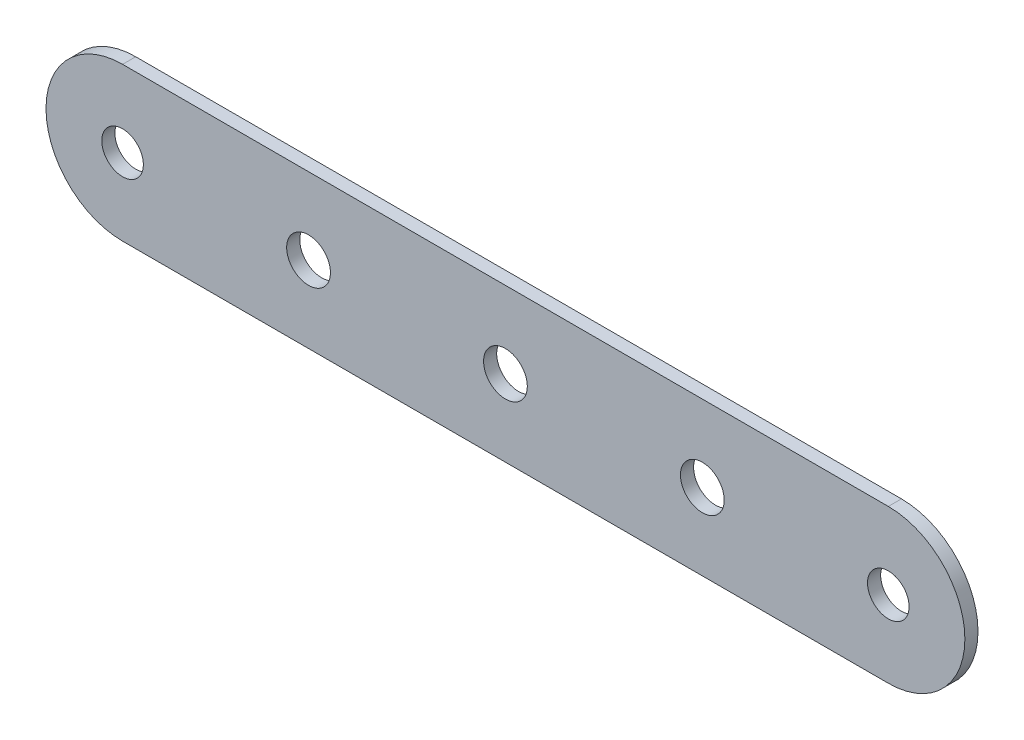
ISO-10303-21;
HEADER;
FILE_DESCRIPTION(('STEP AP214'),'2;1');
FILE_NAME('part.step','',(''),(''),'','','');
FILE_SCHEMA(('AUTOMOTIVE_DESIGN { 1 0 10303 214 1 1 1 1 }'));
ENDSEC;
DATA;
#1=APPLICATION_CONTEXT('core data for automotive mechanical design processes');
#2=APPLICATION_PROTOCOL_DEFINITION('international standard','automotive_design',2000,#1);
#3=PRODUCT_CONTEXT('',#1,'mechanical');
#4=PRODUCT('Part','Part','',(#3));
#5=PRODUCT_RELATED_PRODUCT_CATEGORY('part','',(#4));
#6=PRODUCT_DEFINITION_FORMATION('','',#4);
#7=PRODUCT_DEFINITION_CONTEXT('part definition',#1,'design');
#8=PRODUCT_DEFINITION('design','',#6,#7);
#9=PRODUCT_DEFINITION_SHAPE('','',#8);
#10=(LENGTH_UNIT() NAMED_UNIT(*) SI_UNIT(.MILLI.,.METRE.));
#11=(NAMED_UNIT(*) PLANE_ANGLE_UNIT() SI_UNIT($,.RADIAN.));
#12=(NAMED_UNIT(*) SI_UNIT($,.STERADIAN.) SOLID_ANGLE_UNIT());
#13=UNCERTAINTY_MEASURE_WITH_UNIT(LENGTH_MEASURE(1.E-05),#10,'distance_accuracy_value','');
#14=(GEOMETRIC_REPRESENTATION_CONTEXT(3) GLOBAL_UNCERTAINTY_ASSIGNED_CONTEXT((#13)) GLOBAL_UNIT_ASSIGNED_CONTEXT((#10,
#11,#12)) REPRESENTATION_CONTEXT('',''));
#15=CARTESIAN_POINT('',(0.,0.,0.));
#16=DIRECTION('',(0.,0.,1.));
#17=DIRECTION('',(1.,0.,0.));
#18=AXIS2_PLACEMENT_3D('',#15,#16,#17);
#19=CARTESIAN_POINT('',(-35.5296878485161,2.13114754098369,6.));
#20=DIRECTION('',(0.,0.,1.));
#21=DIRECTION('',(1.,0.,0.));
#22=AXIS2_PLACEMENT_3D('',#19,#20,#21);
#23=PLANE('',#22);
#24=CARTESIAN_POINT('',(229.470312151484,2.13114754098369,6.));
#25=DIRECTION('',(0.,0.,1.));
#26=DIRECTION('',(1.,0.,0.));
#27=AXIS2_PLACEMENT_3D('',#24,#25,#26);
#28=CIRCLE('',#27,10.);
#29=CARTESIAN_POINT('',(239.470312151484,2.13114754098369,6.));
#30=VERTEX_POINT('',#29);
#31=EDGE_CURVE('E134',#30,#30,#28,.T.);
#32=ORIENTED_EDGE('',*,*,#31,.F.);
#33=EDGE_LOOP('',(#32));
#34=FACE_BOUND('',#33,.T.);
#35=CARTESIAN_POINT('',(314.470312151484,2.13114754098369,6.));
#36=DIRECTION('',(0.,0.,1.));
#37=DIRECTION('',(1.,0.,0.));
#38=AXIS2_PLACEMENT_3D('',#35,#36,#37);
#39=CIRCLE('',#38,9.50000000000001);
#40=CARTESIAN_POINT('',(323.970312151484,2.13114754098369,6.));
#41=VERTEX_POINT('',#40);
#42=EDGE_CURVE('E123',#41,#41,#39,.T.);
#43=ORIENTED_EDGE('',*,*,#42,.F.);
#44=EDGE_LOOP('',(#43));
#45=FACE_BOUND('',#44,.T.);
#46=CARTESIAN_POINT('',(-35.5296878485161,2.13114754098369,6.));
#47=DIRECTION('',(0.,0.,1.));
#48=DIRECTION('',(1.,0.,0.));
#49=AXIS2_PLACEMENT_3D('',#46,#47,#48);
#50=CIRCLE('',#49,35.);
#51=CARTESIAN_POINT('',(-35.5296878485161,37.1311475409837,6.));
#52=VERTEX_POINT('',#51);
#53=CARTESIAN_POINT('',(-35.5296878485161,-32.8688524590163,6.));
#54=VERTEX_POINT('',#53);
#55=EDGE_CURVE('E91',#52,#54,#50,.T.);
#56=ORIENTED_EDGE('',*,*,#55,.T.);
#57=DIRECTION('',(1.,0.,0.));
#58=VECTOR('',#57,1.);
#59=CARTESIAN_POINT('',(-35.5296878485161,-32.8688524590163,6.));
#60=LINE('',#59,#58);
#61=CARTESIAN_POINT('',(314.470312151484,-32.8688524590163,6.));
#62=VERTEX_POINT('',#61);
#63=EDGE_CURVE('E86',#54,#62,#60,.T.);
#64=ORIENTED_EDGE('',*,*,#63,.T.);
#65=CARTESIAN_POINT('',(314.470312151484,2.13114754098369,6.));
#66=DIRECTION('',(0.,0.,1.));
#67=DIRECTION('',(1.,0.,0.));
#68=AXIS2_PLACEMENT_3D('',#65,#66,#67);
#69=CIRCLE('',#68,35.);
#70=CARTESIAN_POINT('',(314.470312151484,37.1311475409837,6.));
#71=VERTEX_POINT('',#70);
#72=EDGE_CURVE('E89',#62,#71,#69,.T.);
#73=ORIENTED_EDGE('',*,*,#72,.T.);
#74=DIRECTION('',(-1.,0.,0.));
#75=VECTOR('',#74,1.);
#76=CARTESIAN_POINT('',(-35.5296878485161,37.1311475409837,6.));
#77=LINE('',#76,#75);
#78=EDGE_CURVE('E56',#71,#52,#77,.T.);
#79=ORIENTED_EDGE('',*,*,#78,.T.);
#80=EDGE_LOOP('',(#56,#64,#73,#79));
#81=FACE_BOUND('',#80,.T.);
#82=CARTESIAN_POINT('',(-35.5296878485161,2.13114754098369,6.));
#83=DIRECTION('',(0.,0.,1.));
#84=DIRECTION('',(1.,0.,0.));
#85=AXIS2_PLACEMENT_3D('',#82,#83,#84);
#86=CIRCLE('',#85,9.5);
#87=CARTESIAN_POINT('',(-26.0296878485161,2.13114754098369,6.));
#88=VERTEX_POINT('',#87);
#89=EDGE_CURVE('E113',#88,#88,#86,.T.);
#90=ORIENTED_EDGE('',*,*,#89,.F.);
#91=EDGE_LOOP('',(#90));
#92=FACE_BOUND('',#91,.T.);
#93=CARTESIAN_POINT('',(139.470312151484,2.13114754098369,6.));
#94=DIRECTION('',(0.,0.,1.));
#95=DIRECTION('',(1.,0.,0.));
#96=AXIS2_PLACEMENT_3D('',#93,#94,#95);
#97=CIRCLE('',#96,10.);
#98=CARTESIAN_POINT('',(149.470312151484,2.13114754098369,6.));
#99=VERTEX_POINT('',#98);
#100=EDGE_CURVE('E133',#99,#99,#97,.T.);
#101=ORIENTED_EDGE('',*,*,#100,.F.);
#102=EDGE_LOOP('',(#101));
#103=FACE_BOUND('',#102,.T.);
#104=CARTESIAN_POINT('',(49.4703121514839,2.13114754098305,6.));
#105=DIRECTION('',(0.,0.,1.));
#106=DIRECTION('',(1.,0.,0.));
#107=AXIS2_PLACEMENT_3D('',#104,#105,#106);
#108=CIRCLE('',#107,10.);
#109=CARTESIAN_POINT('',(59.4703121514839,2.13114754098305,6.));
#110=VERTEX_POINT('',#109);
#111=EDGE_CURVE('E140',#110,#110,#108,.T.);
#112=ORIENTED_EDGE('',*,*,#111,.F.);
#113=EDGE_LOOP('',(#112));
#114=FACE_BOUND('',#113,.T.);
#115=ADVANCED_FACE('F39',(#34,#45,#81,#92,#103,#114),#23,.T.);
#116=CARTESIAN_POINT('',(-35.5296878485161,2.13114754098369,0.));
#117=DIRECTION('',(0.,0.,1.));
#118=DIRECTION('',(1.,0.,0.));
#119=AXIS2_PLACEMENT_3D('',#116,#117,#118);
#120=PLANE('',#119);
#121=CARTESIAN_POINT('',(-35.5296878485161,2.13114754098369,0.));
#122=DIRECTION('',(0.,0.,1.));
#123=DIRECTION('',(1.,0.,0.));
#124=AXIS2_PLACEMENT_3D('',#121,#122,#123);
#125=CIRCLE('',#124,35.);
#126=CARTESIAN_POINT('',(-35.5296878485161,37.1311475409837,0.));
#127=VERTEX_POINT('',#126);
#128=CARTESIAN_POINT('',(-35.5296878485161,-32.8688524590163,0.));
#129=VERTEX_POINT('',#128);
#130=EDGE_CURVE('E118',#127,#129,#125,.T.);
#131=ORIENTED_EDGE('',*,*,#130,.F.);
#132=DIRECTION('',(-1.,0.,0.));
#133=VECTOR('',#132,1.);
#134=CARTESIAN_POINT('',(-35.5296878485161,37.1311475409837,0.));
#135=LINE('',#134,#133);
#136=CARTESIAN_POINT('',(314.470312151484,37.1311475409837,0.));
#137=VERTEX_POINT('',#136);
#138=EDGE_CURVE('E79',#137,#127,#135,.T.);
#139=ORIENTED_EDGE('',*,*,#138,.F.);
#140=CARTESIAN_POINT('',(314.470312151484,2.13114754098369,0.));
#141=DIRECTION('',(0.,0.,1.));
#142=DIRECTION('',(1.,0.,0.));
#143=AXIS2_PLACEMENT_3D('',#140,#141,#142);
#144=CIRCLE('',#143,35.);
#145=CARTESIAN_POINT('',(314.470312151484,-32.8688524590163,0.));
#146=VERTEX_POINT('',#145);
#147=EDGE_CURVE('E73',#146,#137,#144,.T.);
#148=ORIENTED_EDGE('',*,*,#147,.F.);
#149=DIRECTION('',(1.,0.,0.));
#150=VECTOR('',#149,1.);
#151=CARTESIAN_POINT('',(-35.5296878485161,-32.8688524590163,0.));
#152=LINE('',#151,#150);
#153=EDGE_CURVE('E95',#129,#146,#152,.T.);
#154=ORIENTED_EDGE('',*,*,#153,.F.);
#155=EDGE_LOOP('',(#131,#139,#148,#154));
#156=FACE_BOUND('',#155,.T.);
#157=CARTESIAN_POINT('',(-35.5296878485161,2.13114754098369,0.));
#158=DIRECTION('',(0.,0.,1.));
#159=DIRECTION('',(1.,0.,0.));
#160=AXIS2_PLACEMENT_3D('',#157,#158,#159);
#161=CIRCLE('',#160,9.5);
#162=CARTESIAN_POINT('',(-26.0296878485161,2.13114754098369,0.));
#163=VERTEX_POINT('',#162);
#164=EDGE_CURVE('E119',#163,#163,#161,.T.);
#165=ORIENTED_EDGE('',*,*,#164,.T.);
#166=EDGE_LOOP('',(#165));
#167=FACE_BOUND('',#166,.T.);
#168=CARTESIAN_POINT('',(314.470312151484,2.13114754098369,0.));
#169=DIRECTION('',(0.,0.,1.));
#170=DIRECTION('',(1.,0.,0.));
#171=AXIS2_PLACEMENT_3D('',#168,#169,#170);
#172=CIRCLE('',#171,9.50000000000001);
#173=CARTESIAN_POINT('',(323.970312151484,2.13114754098369,0.));
#174=VERTEX_POINT('',#173);
#175=EDGE_CURVE('E120',#174,#174,#172,.T.);
#176=ORIENTED_EDGE('',*,*,#175,.T.);
#177=EDGE_LOOP('',(#176));
#178=FACE_BOUND('',#177,.T.);
#179=CARTESIAN_POINT('',(139.470312151484,2.13114754098369,0.));
#180=DIRECTION('',(0.,0.,1.));
#181=DIRECTION('',(1.,0.,0.));
#182=AXIS2_PLACEMENT_3D('',#179,#180,#181);
#183=CIRCLE('',#182,10.);
#184=CARTESIAN_POINT('',(149.470312151484,2.13114754098369,0.));
#185=VERTEX_POINT('',#184);
#186=EDGE_CURVE('E131',#185,#185,#183,.T.);
#187=ORIENTED_EDGE('',*,*,#186,.T.);
#188=EDGE_LOOP('',(#187));
#189=FACE_BOUND('',#188,.T.);
#190=CARTESIAN_POINT('',(229.470312151484,2.13114754098369,0.));
#191=DIRECTION('',(0.,0.,1.));
#192=DIRECTION('',(1.,0.,0.));
#193=AXIS2_PLACEMENT_3D('',#190,#191,#192);
#194=CIRCLE('',#193,10.);
#195=CARTESIAN_POINT('',(239.470312151484,2.13114754098369,0.));
#196=VERTEX_POINT('',#195);
#197=EDGE_CURVE('E138',#196,#196,#194,.T.);
#198=ORIENTED_EDGE('',*,*,#197,.T.);
#199=EDGE_LOOP('',(#198));
#200=FACE_BOUND('',#199,.T.);
#201=CARTESIAN_POINT('',(49.4703121514839,2.13114754098305,0.));
#202=DIRECTION('',(0.,0.,1.));
#203=DIRECTION('',(1.,0.,0.));
#204=AXIS2_PLACEMENT_3D('',#201,#202,#203);
#205=CIRCLE('',#204,10.);
#206=CARTESIAN_POINT('',(59.4703121514839,2.13114754098305,0.));
#207=VERTEX_POINT('',#206);
#208=EDGE_CURVE('E144',#207,#207,#205,.T.);
#209=ORIENTED_EDGE('',*,*,#208,.T.);
#210=EDGE_LOOP('',(#209));
#211=FACE_BOUND('',#210,.T.);
#212=ADVANCED_FACE('F154',(#156,#167,#178,#189,#200,#211),#120,.F.);
#213=CARTESIAN_POINT('',(-35.5296878485161,2.13114754098369,6.));
#214=DIRECTION('',(0.,0.,-1.));
#215=DIRECTION('',(-1.,0.,0.));
#216=AXIS2_PLACEMENT_3D('',#213,#214,#215);
#217=CYLINDRICAL_SURFACE('',#216,35.);
#218=ORIENTED_EDGE('',*,*,#130,.T.);
#219=DIRECTION('',(0.,0.,-1.));
#220=VECTOR('',#219,1.);
#221=CARTESIAN_POINT('',(-35.5296878485161,-32.8688524590163,6.));
#222=LINE('',#221,#220);
#223=EDGE_CURVE('E12',#54,#129,#222,.T.);
#224=ORIENTED_EDGE('',*,*,#223,.F.);
#225=ORIENTED_EDGE('',*,*,#55,.F.);
#226=DIRECTION('',(0.,0.,-1.));
#227=VECTOR('',#226,1.);
#228=CARTESIAN_POINT('',(-35.5296878485161,37.1311475409837,6.));
#229=LINE('',#228,#227);
#230=EDGE_CURVE('E99',#52,#127,#229,.T.);
#231=ORIENTED_EDGE('',*,*,#230,.T.);
#232=EDGE_LOOP('',(#218,#224,#225,#231));
#233=FACE_BOUND('',#232,.T.);
#234=ADVANCED_FACE('F41',(#233),#217,.T.);
#235=CARTESIAN_POINT('',(-35.5296878485161,-32.8688524590163,6.));
#236=DIRECTION('',(0.,1.,0.));
#237=DIRECTION('',(0.,0.,1.));
#238=AXIS2_PLACEMENT_3D('',#235,#236,#237);
#239=PLANE('',#238);
#240=ORIENTED_EDGE('',*,*,#153,.T.);
#241=DIRECTION('',(0.,0.,-1.));
#242=VECTOR('',#241,1.);
#243=CARTESIAN_POINT('',(314.470312151484,-32.8688524590163,6.));
#244=LINE('',#243,#242);
#245=EDGE_CURVE('E48',#62,#146,#244,.T.);
#246=ORIENTED_EDGE('',*,*,#245,.F.);
#247=ORIENTED_EDGE('',*,*,#63,.F.);
#248=ORIENTED_EDGE('',*,*,#223,.T.);
#249=EDGE_LOOP('',(#240,#246,#247,#248));
#250=FACE_BOUND('',#249,.T.);
#251=ADVANCED_FACE('F94',(#250),#239,.F.);
#252=CARTESIAN_POINT('',(314.470312151484,2.13114754098369,6.));
#253=DIRECTION('',(0.,0.,-1.));
#254=DIRECTION('',(-1.,0.,0.));
#255=AXIS2_PLACEMENT_3D('',#252,#253,#254);
#256=CYLINDRICAL_SURFACE('',#255,35.);
#257=ORIENTED_EDGE('',*,*,#147,.T.);
#258=DIRECTION('',(0.,0.,-1.));
#259=VECTOR('',#258,1.);
#260=CARTESIAN_POINT('',(314.470312151484,37.1311475409837,6.));
#261=LINE('',#260,#259);
#262=EDGE_CURVE('E96',#71,#137,#261,.T.);
#263=ORIENTED_EDGE('',*,*,#262,.F.);
#264=ORIENTED_EDGE('',*,*,#72,.F.);
#265=ORIENTED_EDGE('',*,*,#245,.T.);
#266=EDGE_LOOP('',(#257,#263,#264,#265));
#267=FACE_BOUND('',#266,.T.);
#268=ADVANCED_FACE('F97',(#267),#256,.T.);
#269=CARTESIAN_POINT('',(-35.5296878485161,37.1311475409837,6.));
#270=DIRECTION('',(0.,-1.,0.));
#271=DIRECTION('',(0.,0.,-1.));
#272=AXIS2_PLACEMENT_3D('',#269,#270,#271);
#273=PLANE('',#272);
#274=ORIENTED_EDGE('',*,*,#138,.T.);
#275=ORIENTED_EDGE('',*,*,#230,.F.);
#276=ORIENTED_EDGE('',*,*,#78,.F.);
#277=ORIENTED_EDGE('',*,*,#262,.T.);
#278=EDGE_LOOP('',(#274,#275,#276,#277));
#279=FACE_BOUND('',#278,.T.);
#280=ADVANCED_FACE('F168',(#279),#273,.F.);
#281=CARTESIAN_POINT('',(-35.5296878485161,2.13114754098369,6.));
#282=DIRECTION('',(0.,0.,-1.));
#283=DIRECTION('',(-1.,0.,0.));
#284=AXIS2_PLACEMENT_3D('',#281,#282,#283);
#285=CYLINDRICAL_SURFACE('',#284,9.5);
#286=ORIENTED_EDGE('',*,*,#89,.T.);
#287=EDGE_LOOP('',(#286));
#288=FACE_BOUND('',#287,.T.);
#289=ORIENTED_EDGE('',*,*,#164,.F.);
#290=EDGE_LOOP('',(#289));
#291=FACE_BOUND('',#290,.T.);
#292=ADVANCED_FACE('F165',(#288,#291),#285,.F.);
#293=CARTESIAN_POINT('',(314.470312151484,2.13114754098369,6.));
#294=DIRECTION('',(0.,0.,-1.));
#295=DIRECTION('',(-1.,0.,0.));
#296=AXIS2_PLACEMENT_3D('',#293,#294,#295);
#297=CYLINDRICAL_SURFACE('',#296,9.50000000000001);
#298=ORIENTED_EDGE('',*,*,#42,.T.);
#299=EDGE_LOOP('',(#298));
#300=FACE_BOUND('',#299,.T.);
#301=ORIENTED_EDGE('',*,*,#175,.F.);
#302=EDGE_LOOP('',(#301));
#303=FACE_BOUND('',#302,.T.);
#304=ADVANCED_FACE('F208',(#300,#303),#297,.F.);
#305=CARTESIAN_POINT('',(139.470312151484,2.13114754098369,6.));
#306=DIRECTION('',(0.,0.,-1.));
#307=DIRECTION('',(-1.,0.,0.));
#308=AXIS2_PLACEMENT_3D('',#305,#306,#307);
#309=CYLINDRICAL_SURFACE('',#308,10.);
#310=ORIENTED_EDGE('',*,*,#100,.T.);
#311=EDGE_LOOP('',(#310));
#312=FACE_BOUND('',#311,.T.);
#313=ORIENTED_EDGE('',*,*,#186,.F.);
#314=EDGE_LOOP('',(#313));
#315=FACE_BOUND('',#314,.T.);
#316=ADVANCED_FACE('F203',(#312,#315),#309,.F.);
#317=CARTESIAN_POINT('',(229.470312151484,2.13114754098369,6.));
#318=DIRECTION('',(0.,0.,-1.));
#319=DIRECTION('',(-1.,0.,0.));
#320=AXIS2_PLACEMENT_3D('',#317,#318,#319);
#321=CYLINDRICAL_SURFACE('',#320,10.);
#322=ORIENTED_EDGE('',*,*,#31,.T.);
#323=EDGE_LOOP('',(#322));
#324=FACE_BOUND('',#323,.T.);
#325=ORIENTED_EDGE('',*,*,#197,.F.);
#326=EDGE_LOOP('',(#325));
#327=FACE_BOUND('',#326,.T.);
#328=ADVANCED_FACE('F198',(#324,#327),#321,.F.);
#329=CARTESIAN_POINT('',(49.4703121514839,2.13114754098305,6.));
#330=DIRECTION('',(0.,0.,-1.));
#331=DIRECTION('',(-1.,0.,0.));
#332=AXIS2_PLACEMENT_3D('',#329,#330,#331);
#333=CYLINDRICAL_SURFACE('',#332,10.);
#334=ORIENTED_EDGE('',*,*,#111,.T.);
#335=EDGE_LOOP('',(#334));
#336=FACE_BOUND('',#335,.T.);
#337=ORIENTED_EDGE('',*,*,#208,.F.);
#338=EDGE_LOOP('',(#337));
#339=FACE_BOUND('',#338,.T.);
#340=ADVANCED_FACE('F150',(#336,#339),#333,.F.);
#341=CLOSED_SHELL('',(#115,#212,#234,#251,#268,#280,#292,#304,#316,#328,#340));
#342=MANIFOLD_SOLID_BREP('B2',#341);
#343=ADVANCED_BREP_SHAPE_REPRESENTATION('',(#18,#342),#14);
#344=SHAPE_DEFINITION_REPRESENTATION(#9,#343);
ENDSEC;
END-ISO-10303-21;
